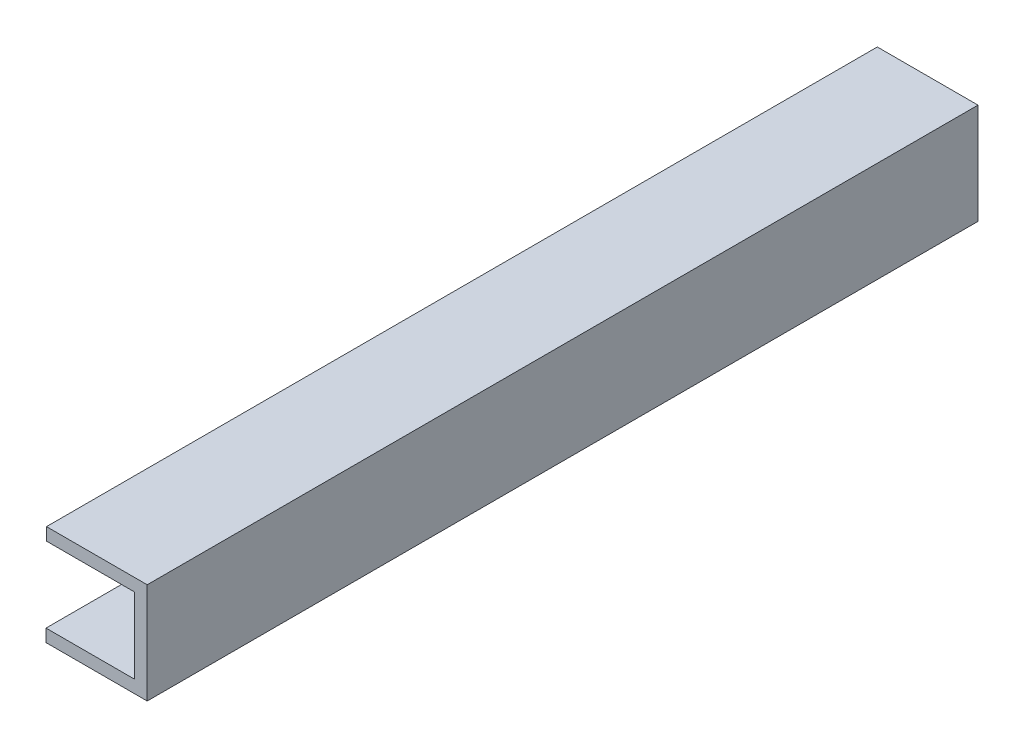
ISO-10303-21;
HEADER;
FILE_DESCRIPTION(('STEP AP214'),'2;1');
FILE_NAME('part.step','',(''),(''),'','','');
FILE_SCHEMA(('AUTOMOTIVE_DESIGN { 1 0 10303 214 1 1 1 1 }'));
ENDSEC;
DATA;
#1=APPLICATION_CONTEXT('core data for automotive mechanical design processes');
#2=APPLICATION_PROTOCOL_DEFINITION('international standard','automotive_design',2000,#1);
#3=PRODUCT_CONTEXT('',#1,'mechanical');
#4=PRODUCT('Part','Part','',(#3));
#5=PRODUCT_RELATED_PRODUCT_CATEGORY('part','',(#4));
#6=PRODUCT_DEFINITION_FORMATION('','',#4);
#7=PRODUCT_DEFINITION_CONTEXT('part definition',#1,'design');
#8=PRODUCT_DEFINITION('design','',#6,#7);
#9=PRODUCT_DEFINITION_SHAPE('','',#8);
#10=(LENGTH_UNIT() NAMED_UNIT(*) SI_UNIT(.MILLI.,.METRE.));
#11=(NAMED_UNIT(*) PLANE_ANGLE_UNIT() SI_UNIT($,.RADIAN.));
#12=(NAMED_UNIT(*) SI_UNIT($,.STERADIAN.) SOLID_ANGLE_UNIT());
#13=UNCERTAINTY_MEASURE_WITH_UNIT(LENGTH_MEASURE(1.E-05),#10,'distance_accuracy_value','');
#14=(GEOMETRIC_REPRESENTATION_CONTEXT(3) GLOBAL_UNCERTAINTY_ASSIGNED_CONTEXT((#13)) GLOBAL_UNIT_ASSIGNED_CONTEXT((#10,
#11,#12)) REPRESENTATION_CONTEXT('',''));
#15=CARTESIAN_POINT('',(0.,0.,0.));
#16=DIRECTION('',(0.,0.,1.));
#17=DIRECTION('',(1.,0.,0.));
#18=AXIS2_PLACEMENT_3D('',#15,#16,#17);
#19=CARTESIAN_POINT('',(-10.531581633942,6.84043592370634,209.55));
#20=DIRECTION('',(0.,-1.,0.));
#21=DIRECTION('',(1.,0.,0.));
#22=AXIS2_PLACEMENT_3D('',#19,#20,#21);
#23=PLANE('',#22);
#24=DIRECTION('',(-1.,0.,0.));
#25=VECTOR('',#24,1.);
#26=CARTESIAN_POINT('',(-10.531581633942,6.84043592370634,0.));
#27=LINE('',#26,#25);
#28=CARTESIAN_POINT('',(-10.531581633942,6.84043592370634,0.));
#29=VERTEX_POINT('',#28);
#30=CARTESIAN_POINT('',(-35.931581633942,6.84043592370634,0.));
#31=VERTEX_POINT('',#30);
#32=EDGE_CURVE('E129',#29,#31,#27,.T.);
#33=ORIENTED_EDGE('',*,*,#32,.T.);
#34=DIRECTION('',(0.,0.,-1.));
#35=VECTOR('',#34,1.);
#36=CARTESIAN_POINT('',(-35.931581633942,6.84043592370634,209.55));
#37=LINE('',#36,#35);
#38=CARTESIAN_POINT('',(-35.931581633942,6.84043592370634,209.55));
#39=VERTEX_POINT('',#38);
#40=EDGE_CURVE('E11',#39,#31,#37,.T.);
#41=ORIENTED_EDGE('',*,*,#40,.F.);
#42=DIRECTION('',(-1.,0.,0.));
#43=VECTOR('',#42,1.);
#44=CARTESIAN_POINT('',(-10.531581633942,6.84043592370634,209.55));
#45=LINE('',#44,#43);
#46=CARTESIAN_POINT('',(-10.531581633942,6.84043592370634,209.55));
#47=VERTEX_POINT('',#46);
#48=EDGE_CURVE('E143',#47,#39,#45,.T.);
#49=ORIENTED_EDGE('',*,*,#48,.F.);
#50=DIRECTION('',(0.,0.,-1.));
#51=VECTOR('',#50,1.);
#52=CARTESIAN_POINT('',(-10.531581633942,6.84043592370634,209.55));
#53=LINE('',#52,#51);
#54=EDGE_CURVE('E125',#47,#29,#53,.T.);
#55=ORIENTED_EDGE('',*,*,#54,.T.);
#56=EDGE_LOOP('',(#33,#41,#49,#55));
#57=FACE_BOUND('',#56,.T.);
#58=ADVANCED_FACE('F33',(#57),#23,.F.);
#59=CARTESIAN_POINT('',(-35.931581633942,6.84043592370634,209.55));
#60=DIRECTION('',(1.,0.,0.));
#61=DIRECTION('',(0.,0.,-1.));
#62=AXIS2_PLACEMENT_3D('',#59,#60,#61);
#63=PLANE('',#62);
#64=DIRECTION('',(0.,-1.,0.));
#65=VECTOR('',#64,1.);
#66=CARTESIAN_POINT('',(-35.931581633942,6.84043592370634,0.));
#67=LINE('',#66,#65);
#68=CARTESIAN_POINT('',(-35.931581633942,3.66543592370634,0.));
#69=VERTEX_POINT('',#68);
#70=EDGE_CURVE('E132',#31,#69,#67,.T.);
#71=ORIENTED_EDGE('',*,*,#70,.T.);
#72=DIRECTION('',(0.,0.,-1.));
#73=VECTOR('',#72,1.);
#74=CARTESIAN_POINT('',(-35.931581633942,3.66543592370634,209.55));
#75=LINE('',#74,#73);
#76=CARTESIAN_POINT('',(-35.931581633942,3.66543592370634,209.55));
#77=VERTEX_POINT('',#76);
#78=EDGE_CURVE('E41',#77,#69,#75,.T.);
#79=ORIENTED_EDGE('',*,*,#78,.F.);
#80=DIRECTION('',(0.,-1.,0.));
#81=VECTOR('',#80,1.);
#82=CARTESIAN_POINT('',(-35.931581633942,6.84043592370634,209.55));
#83=LINE('',#82,#81);
#84=EDGE_CURVE('E92',#39,#77,#83,.T.);
#85=ORIENTED_EDGE('',*,*,#84,.F.);
#86=ORIENTED_EDGE('',*,*,#40,.T.);
#87=EDGE_LOOP('',(#71,#79,#85,#86));
#88=FACE_BOUND('',#87,.T.);
#89=ADVANCED_FACE('F178',(#88),#63,.F.);
#90=CARTESIAN_POINT('',(-35.931581633942,3.66543592370634,209.55));
#91=DIRECTION('',(0.,1.,0.));
#92=DIRECTION('',(0.,0.,1.));
#93=AXIS2_PLACEMENT_3D('',#90,#91,#92);
#94=PLANE('',#93);
#95=DIRECTION('',(1.,0.,0.));
#96=VECTOR('',#95,1.);
#97=CARTESIAN_POINT('',(-35.931581633942,3.66543592370634,0.));
#98=LINE('',#97,#96);
#99=CARTESIAN_POINT('',(-13.706581633942,3.66543592370634,0.));
#100=VERTEX_POINT('',#99);
#101=EDGE_CURVE('E134',#69,#100,#98,.T.);
#102=ORIENTED_EDGE('',*,*,#101,.T.);
#103=DIRECTION('',(0.,0.,-1.));
#104=VECTOR('',#103,1.);
#105=CARTESIAN_POINT('',(-13.706581633942,3.66543592370634,209.55));
#106=LINE('',#105,#104);
#107=CARTESIAN_POINT('',(-13.706581633942,3.66543592370634,209.55));
#108=VERTEX_POINT('',#107);
#109=EDGE_CURVE('E150',#108,#100,#106,.T.);
#110=ORIENTED_EDGE('',*,*,#109,.F.);
#111=DIRECTION('',(1.,0.,0.));
#112=VECTOR('',#111,1.);
#113=CARTESIAN_POINT('',(-35.931581633942,3.66543592370634,209.55));
#114=LINE('',#113,#112);
#115=EDGE_CURVE('E158',#77,#108,#114,.T.);
#116=ORIENTED_EDGE('',*,*,#115,.F.);
#117=ORIENTED_EDGE('',*,*,#78,.T.);
#118=EDGE_LOOP('',(#102,#110,#116,#117));
#119=FACE_BOUND('',#118,.T.);
#120=ADVANCED_FACE('F156',(#119),#94,.F.);
#121=CARTESIAN_POINT('',(-13.706581633942,3.66543592370634,209.55));
#122=DIRECTION('',(1.,0.,0.));
#123=DIRECTION('',(0.,1.,0.));
#124=AXIS2_PLACEMENT_3D('',#121,#122,#123);
#125=PLANE('',#124);
#126=DIRECTION('',(0.,-1.,0.));
#127=VECTOR('',#126,1.);
#128=CARTESIAN_POINT('',(-13.706581633942,3.66543592370634,0.));
#129=LINE('',#128,#127);
#130=CARTESIAN_POINT('',(-13.706581633942,-15.3845640762937,0.));
#131=VERTEX_POINT('',#130);
#132=EDGE_CURVE('E136',#100,#131,#129,.T.);
#133=ORIENTED_EDGE('',*,*,#132,.T.);
#134=DIRECTION('',(0.,0.,-1.));
#135=VECTOR('',#134,1.);
#136=CARTESIAN_POINT('',(-13.706581633942,-15.3845640762937,209.55));
#137=LINE('',#136,#135);
#138=CARTESIAN_POINT('',(-13.706581633942,-15.3845640762937,209.55));
#139=VERTEX_POINT('',#138);
#140=EDGE_CURVE('E147',#139,#131,#137,.T.);
#141=ORIENTED_EDGE('',*,*,#140,.F.);
#142=DIRECTION('',(0.,-1.,0.));
#143=VECTOR('',#142,1.);
#144=CARTESIAN_POINT('',(-13.706581633942,3.66543592370634,209.55));
#145=LINE('',#144,#143);
#146=EDGE_CURVE('E170',#108,#139,#145,.T.);
#147=ORIENTED_EDGE('',*,*,#146,.F.);
#148=ORIENTED_EDGE('',*,*,#109,.T.);
#149=EDGE_LOOP('',(#133,#141,#147,#148));
#150=FACE_BOUND('',#149,.T.);
#151=ADVANCED_FACE('F166',(#150),#125,.F.);
#152=CARTESIAN_POINT('',(-13.706581633942,-15.3845640762937,209.55));
#153=DIRECTION('',(0.,-1.,0.));
#154=DIRECTION('',(1.,0.,0.));
#155=AXIS2_PLACEMENT_3D('',#152,#153,#154);
#156=PLANE('',#155);
#157=DIRECTION('',(-1.,0.,0.));
#158=VECTOR('',#157,1.);
#159=CARTESIAN_POINT('',(-13.706581633942,-15.3845640762937,0.));
#160=LINE('',#159,#158);
#161=CARTESIAN_POINT('',(-36.058581633942,-15.3845640762937,0.));
#162=VERTEX_POINT('',#161);
#163=EDGE_CURVE('E138',#131,#162,#160,.T.);
#164=ORIENTED_EDGE('',*,*,#163,.T.);
#165=DIRECTION('',(0.,0.,-1.));
#166=VECTOR('',#165,1.);
#167=CARTESIAN_POINT('',(-36.058581633942,-15.3845640762937,209.55));
#168=LINE('',#167,#166);
#169=CARTESIAN_POINT('',(-36.058581633942,-15.3845640762937,209.55));
#170=VERTEX_POINT('',#169);
#171=EDGE_CURVE('E120',#170,#162,#168,.T.);
#172=ORIENTED_EDGE('',*,*,#171,.F.);
#173=DIRECTION('',(-1.,0.,0.));
#174=VECTOR('',#173,1.);
#175=CARTESIAN_POINT('',(-13.706581633942,-15.3845640762937,209.55));
#176=LINE('',#175,#174);
#177=EDGE_CURVE('E111',#139,#170,#176,.T.);
#178=ORIENTED_EDGE('',*,*,#177,.F.);
#179=ORIENTED_EDGE('',*,*,#140,.T.);
#180=EDGE_LOOP('',(#164,#172,#178,#179));
#181=FACE_BOUND('',#180,.T.);
#182=ADVANCED_FACE('F169',(#181),#156,.F.);
#183=CARTESIAN_POINT('',(-36.058581633942,-15.3845640762937,209.55));
#184=DIRECTION('',(1.,0.,0.));
#185=DIRECTION('',(0.,0.,-1.));
#186=AXIS2_PLACEMENT_3D('',#183,#184,#185);
#187=PLANE('',#186);
#188=DIRECTION('',(0.,-1.,0.));
#189=VECTOR('',#188,1.);
#190=CARTESIAN_POINT('',(-36.058581633942,-15.3845640762937,0.));
#191=LINE('',#190,#189);
#192=CARTESIAN_POINT('',(-36.058581633942,-18.5595640762937,0.));
#193=VERTEX_POINT('',#192);
#194=EDGE_CURVE('E119',#162,#193,#191,.T.);
#195=ORIENTED_EDGE('',*,*,#194,.T.);
#196=DIRECTION('',(0.,0.,-1.));
#197=VECTOR('',#196,1.);
#198=CARTESIAN_POINT('',(-36.058581633942,-18.5595640762937,209.55));
#199=LINE('',#198,#197);
#200=CARTESIAN_POINT('',(-36.058581633942,-18.5595640762937,209.55));
#201=VERTEX_POINT('',#200);
#202=EDGE_CURVE('E116',#201,#193,#199,.T.);
#203=ORIENTED_EDGE('',*,*,#202,.F.);
#204=DIRECTION('',(0.,-1.,0.));
#205=VECTOR('',#204,1.);
#206=CARTESIAN_POINT('',(-36.058581633942,-15.3845640762937,209.55));
#207=LINE('',#206,#205);
#208=EDGE_CURVE('E105',#170,#201,#207,.T.);
#209=ORIENTED_EDGE('',*,*,#208,.F.);
#210=ORIENTED_EDGE('',*,*,#171,.T.);
#211=EDGE_LOOP('',(#195,#203,#209,#210));
#212=FACE_BOUND('',#211,.T.);
#213=ADVANCED_FACE('F117',(#212),#187,.F.);
#214=CARTESIAN_POINT('',(-36.058581633942,-18.5595640762937,209.55));
#215=DIRECTION('',(0.,1.,0.));
#216=DIRECTION('',(0.,0.,1.));
#217=AXIS2_PLACEMENT_3D('',#214,#215,#216);
#218=PLANE('',#217);
#219=DIRECTION('',(1.,0.,0.));
#220=VECTOR('',#219,1.);
#221=CARTESIAN_POINT('',(-36.058581633942,-18.5595640762937,0.));
#222=LINE('',#221,#220);
#223=CARTESIAN_POINT('',(-10.531581633942,-18.5595640762937,0.));
#224=VERTEX_POINT('',#223);
#225=EDGE_CURVE('E78',#193,#224,#222,.T.);
#226=ORIENTED_EDGE('',*,*,#225,.T.);
#227=DIRECTION('',(0.,0.,-1.));
#228=VECTOR('',#227,1.);
#229=CARTESIAN_POINT('',(-10.531581633942,-18.5595640762937,209.55));
#230=LINE('',#229,#228);
#231=CARTESIAN_POINT('',(-10.531581633942,-18.5595640762937,209.55));
#232=VERTEX_POINT('',#231);
#233=EDGE_CURVE('E121',#232,#224,#230,.T.);
#234=ORIENTED_EDGE('',*,*,#233,.F.);
#235=DIRECTION('',(1.,0.,0.));
#236=VECTOR('',#235,1.);
#237=CARTESIAN_POINT('',(-36.058581633942,-18.5595640762937,209.55));
#238=LINE('',#237,#236);
#239=EDGE_CURVE('E109',#201,#232,#238,.T.);
#240=ORIENTED_EDGE('',*,*,#239,.F.);
#241=ORIENTED_EDGE('',*,*,#202,.T.);
#242=EDGE_LOOP('',(#226,#234,#240,#241));
#243=FACE_BOUND('',#242,.T.);
#244=ADVANCED_FACE('F123',(#243),#218,.F.);
#245=CARTESIAN_POINT('',(-10.531581633942,-18.5595640762937,209.55));
#246=DIRECTION('',(-1.,0.,0.));
#247=DIRECTION('',(0.,0.,1.));
#248=AXIS2_PLACEMENT_3D('',#245,#246,#247);
#249=PLANE('',#248);
#250=DIRECTION('',(0.,1.,0.));
#251=VECTOR('',#250,1.);
#252=CARTESIAN_POINT('',(-10.531581633942,-18.5595640762937,0.));
#253=LINE('',#252,#251);
#254=EDGE_CURVE('E84',#224,#29,#253,.T.);
#255=ORIENTED_EDGE('',*,*,#254,.T.);
#256=ORIENTED_EDGE('',*,*,#54,.F.);
#257=DIRECTION('',(0.,1.,0.));
#258=VECTOR('',#257,1.);
#259=CARTESIAN_POINT('',(-10.531581633942,-18.5595640762937,209.55));
#260=LINE('',#259,#258);
#261=EDGE_CURVE('E49',#232,#47,#260,.T.);
#262=ORIENTED_EDGE('',*,*,#261,.F.);
#263=ORIENTED_EDGE('',*,*,#233,.T.);
#264=EDGE_LOOP('',(#255,#256,#262,#263));
#265=FACE_BOUND('',#264,.T.);
#266=ADVANCED_FACE('F194',(#265),#249,.F.);
#267=CARTESIAN_POINT('',(0.,0.,209.55));
#268=DIRECTION('',(0.,0.,1.));
#269=DIRECTION('',(1.,0.,0.));
#270=AXIS2_PLACEMENT_3D('',#267,#268,#269);
#271=PLANE('',#270);
#272=ORIENTED_EDGE('',*,*,#48,.T.);
#273=ORIENTED_EDGE('',*,*,#84,.T.);
#274=ORIENTED_EDGE('',*,*,#115,.T.);
#275=ORIENTED_EDGE('',*,*,#146,.T.);
#276=ORIENTED_EDGE('',*,*,#177,.T.);
#277=ORIENTED_EDGE('',*,*,#208,.T.);
#278=ORIENTED_EDGE('',*,*,#239,.T.);
#279=ORIENTED_EDGE('',*,*,#261,.T.);
#280=EDGE_LOOP('',(#272,#273,#274,#275,#276,#277,#278,#279));
#281=FACE_BOUND('',#280,.T.);
#282=ADVANCED_FACE('F107',(#281),#271,.T.);
#283=CARTESIAN_POINT('',(0.,0.,0.));
#284=DIRECTION('',(0.,0.,1.));
#285=DIRECTION('',(1.,0.,0.));
#286=AXIS2_PLACEMENT_3D('',#283,#284,#285);
#287=PLANE('',#286);
#288=ORIENTED_EDGE('',*,*,#32,.F.);
#289=ORIENTED_EDGE('',*,*,#254,.F.);
#290=ORIENTED_EDGE('',*,*,#225,.F.);
#291=ORIENTED_EDGE('',*,*,#194,.F.);
#292=ORIENTED_EDGE('',*,*,#163,.F.);
#293=ORIENTED_EDGE('',*,*,#132,.F.);
#294=ORIENTED_EDGE('',*,*,#101,.F.);
#295=ORIENTED_EDGE('',*,*,#70,.F.);
#296=EDGE_LOOP('',(#288,#289,#290,#291,#292,#293,#294,#295));
#297=FACE_BOUND('',#296,.T.);
#298=ADVANCED_FACE('F162',(#297),#287,.F.);
#299=CLOSED_SHELL('',(#58,#89,#120,#151,#182,#213,#244,#266,#282,#298));
#300=MANIFOLD_SOLID_BREP('B2',#299);
#301=ADVANCED_BREP_SHAPE_REPRESENTATION('',(#18,#300),#14);
#302=SHAPE_DEFINITION_REPRESENTATION(#9,#301);
ENDSEC;
END-ISO-10303-21;
